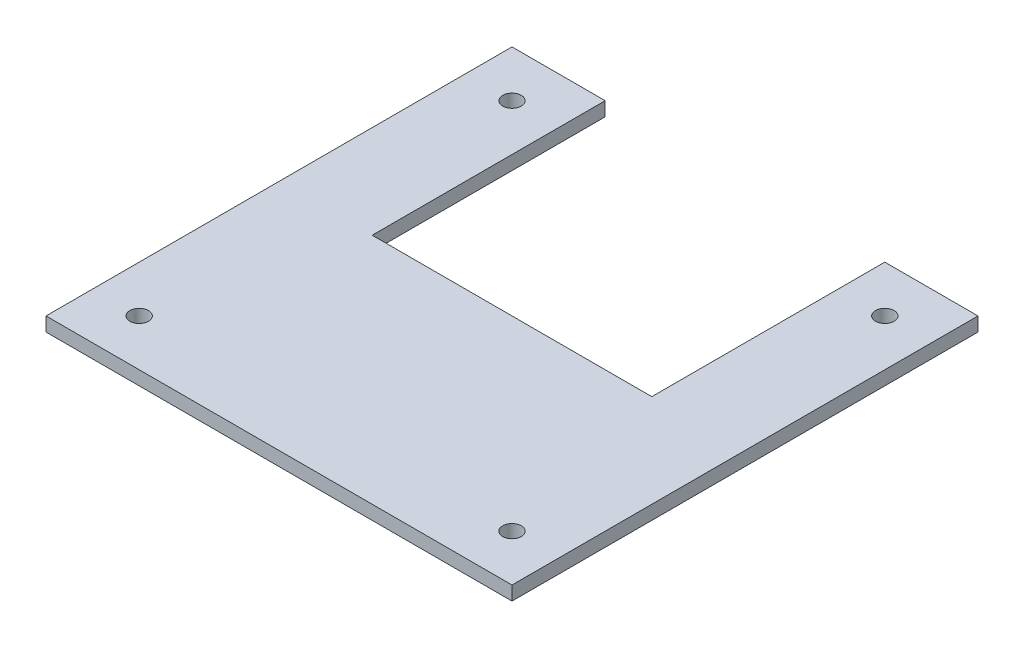
ISO-10303-21;
HEADER;
FILE_DESCRIPTION(('STEP AP214'),'2;1');
FILE_NAME('part.step','',(''),(''),'','','');
FILE_SCHEMA(('AUTOMOTIVE_DESIGN { 1 0 10303 214 1 1 1 1 }'));
ENDSEC;
DATA;
#1=APPLICATION_CONTEXT('core data for automotive mechanical design processes');
#2=APPLICATION_PROTOCOL_DEFINITION('international standard','automotive_design',2000,#1);
#3=PRODUCT_CONTEXT('',#1,'mechanical');
#4=PRODUCT('Part','Part','',(#3));
#5=PRODUCT_RELATED_PRODUCT_CATEGORY('part','',(#4));
#6=PRODUCT_DEFINITION_FORMATION('','',#4);
#7=PRODUCT_DEFINITION_CONTEXT('part definition',#1,'design');
#8=PRODUCT_DEFINITION('design','',#6,#7);
#9=PRODUCT_DEFINITION_SHAPE('','',#8);
#10=(LENGTH_UNIT() NAMED_UNIT(*) SI_UNIT(.MILLI.,.METRE.));
#11=(NAMED_UNIT(*) PLANE_ANGLE_UNIT() SI_UNIT($,.RADIAN.));
#12=(NAMED_UNIT(*) SI_UNIT($,.STERADIAN.) SOLID_ANGLE_UNIT());
#13=UNCERTAINTY_MEASURE_WITH_UNIT(LENGTH_MEASURE(1.E-05),#10,'distance_accuracy_value','');
#14=(GEOMETRIC_REPRESENTATION_CONTEXT(3) GLOBAL_UNCERTAINTY_ASSIGNED_CONTEXT((#13)) GLOBAL_UNIT_ASSIGNED_CONTEXT((#10,
#11,#12)) REPRESENTATION_CONTEXT('',''));
#15=CARTESIAN_POINT('',(0.,0.,0.));
#16=DIRECTION('',(0.,0.,1.));
#17=DIRECTION('',(1.,0.,0.));
#18=AXIS2_PLACEMENT_3D('',#15,#16,#17);
#19=CARTESIAN_POINT('',(0.,3.,0.));
#20=DIRECTION('',(0.,-1.,0.));
#21=DIRECTION('',(0.,0.,-1.));
#22=AXIS2_PLACEMENT_3D('',#19,#20,#21);
#23=PLANE('',#22);
#24=DIRECTION('',(0.,0.,1.));
#25=VECTOR('',#24,1.);
#26=CARTESIAN_POINT('',(-50.,3.,-50.));
#27=LINE('',#26,#25);
#28=CARTESIAN_POINT('',(-50.,3.,-50.));
#29=VERTEX_POINT('',#28);
#30=CARTESIAN_POINT('',(-50.,3.,50.));
#31=VERTEX_POINT('',#30);
#32=EDGE_CURVE('E168',#29,#31,#27,.T.);
#33=ORIENTED_EDGE('',*,*,#32,.T.);
#34=DIRECTION('',(1.,0.,0.));
#35=VECTOR('',#34,1.);
#36=CARTESIAN_POINT('',(50.,3.,50.));
#37=LINE('',#36,#35);
#38=CARTESIAN_POINT('',(50.,3.,50.));
#39=VERTEX_POINT('',#38);
#40=EDGE_CURVE('E104',#31,#39,#37,.T.);
#41=ORIENTED_EDGE('',*,*,#40,.T.);
#42=DIRECTION('',(0.,0.,-1.));
#43=VECTOR('',#42,1.);
#44=CARTESIAN_POINT('',(50.,3.,-50.));
#45=LINE('',#44,#43);
#46=CARTESIAN_POINT('',(50.,3.,-50.));
#47=VERTEX_POINT('',#46);
#48=EDGE_CURVE('E189',#39,#47,#45,.T.);
#49=ORIENTED_EDGE('',*,*,#48,.T.);
#50=DIRECTION('',(-1.,0.,0.));
#51=VECTOR('',#50,1.);
#52=CARTESIAN_POINT('',(50.,3.,-50.));
#53=LINE('',#52,#51);
#54=CARTESIAN_POINT('',(30.,3.,-50.));
#55=VERTEX_POINT('',#54);
#56=EDGE_CURVE('E203',#47,#55,#53,.T.);
#57=ORIENTED_EDGE('',*,*,#56,.T.);
#58=DIRECTION('',(0.,0.,1.));
#59=VECTOR('',#58,1.);
#60=CARTESIAN_POINT('',(30.,3.,0.));
#61=LINE('',#60,#59);
#62=CARTESIAN_POINT('',(30.,3.,0.));
#63=VERTEX_POINT('',#62);
#64=EDGE_CURVE('E123',#55,#63,#61,.T.);
#65=ORIENTED_EDGE('',*,*,#64,.T.);
#66=DIRECTION('',(-1.,0.,0.));
#67=VECTOR('',#66,1.);
#68=CARTESIAN_POINT('',(-30.,3.,0.));
#69=LINE('',#68,#67);
#70=CARTESIAN_POINT('',(-30.,3.,0.));
#71=VERTEX_POINT('',#70);
#72=EDGE_CURVE('E117',#63,#71,#69,.T.);
#73=ORIENTED_EDGE('',*,*,#72,.T.);
#74=DIRECTION('',(0.,0.,-1.));
#75=VECTOR('',#74,1.);
#76=CARTESIAN_POINT('',(-30.,3.,-50.));
#77=LINE('',#76,#75);
#78=CARTESIAN_POINT('',(-30.,3.,-50.));
#79=VERTEX_POINT('',#78);
#80=EDGE_CURVE('E121',#71,#79,#77,.T.);
#81=ORIENTED_EDGE('',*,*,#80,.T.);
#82=DIRECTION('',(-1.,0.,0.));
#83=VECTOR('',#82,1.);
#84=CARTESIAN_POINT('',(-30.,3.,-50.));
#85=LINE('',#84,#83);
#86=EDGE_CURVE('E61',#79,#29,#85,.T.);
#87=ORIENTED_EDGE('',*,*,#86,.T.);
#88=EDGE_LOOP('',(#33,#41,#49,#57,#65,#73,#81,#87));
#89=FACE_BOUND('',#88,.T.);
#90=CARTESIAN_POINT('',(-40.,3.,40.));
#91=DIRECTION('',(0.,1.,0.));
#92=DIRECTION('',(0.,0.,1.));
#93=AXIS2_PLACEMENT_3D('',#90,#91,#92);
#94=CIRCLE('',#93,2.);
#95=CARTESIAN_POINT('',(-40.,3.,42.));
#96=VERTEX_POINT('',#95);
#97=EDGE_CURVE('E150',#96,#96,#94,.T.);
#98=ORIENTED_EDGE('',*,*,#97,.F.);
#99=EDGE_LOOP('',(#98));
#100=FACE_BOUND('',#99,.T.);
#101=CARTESIAN_POINT('',(40.,3.,40.));
#102=DIRECTION('',(0.,1.,0.));
#103=DIRECTION('',(0.,0.,-1.));
#104=AXIS2_PLACEMENT_3D('',#101,#102,#103);
#105=CIRCLE('',#104,2.);
#106=CARTESIAN_POINT('',(40.,3.,38.));
#107=VERTEX_POINT('',#106);
#108=EDGE_CURVE('E217',#107,#107,#105,.T.);
#109=ORIENTED_EDGE('',*,*,#108,.F.);
#110=EDGE_LOOP('',(#109));
#111=FACE_BOUND('',#110,.T.);
#112=CARTESIAN_POINT('',(40.,3.,-40.));
#113=DIRECTION('',(0.,1.,0.));
#114=DIRECTION('',(0.,0.,1.));
#115=AXIS2_PLACEMENT_3D('',#112,#113,#114);
#116=CIRCLE('',#115,2.);
#117=CARTESIAN_POINT('',(40.,3.,-38.));
#118=VERTEX_POINT('',#117);
#119=EDGE_CURVE('E225',#118,#118,#116,.T.);
#120=ORIENTED_EDGE('',*,*,#119,.F.);
#121=EDGE_LOOP('',(#120));
#122=FACE_BOUND('',#121,.T.);
#123=CARTESIAN_POINT('',(-40.,3.,-40.));
#124=DIRECTION('',(0.,1.,0.));
#125=DIRECTION('',(0.,0.,-1.));
#126=AXIS2_PLACEMENT_3D('',#123,#124,#125);
#127=CIRCLE('',#126,2.);
#128=CARTESIAN_POINT('',(-40.,3.,-42.));
#129=VERTEX_POINT('',#128);
#130=EDGE_CURVE('E233',#129,#129,#127,.T.);
#131=ORIENTED_EDGE('',*,*,#130,.F.);
#132=EDGE_LOOP('',(#131));
#133=FACE_BOUND('',#132,.T.);
#134=ADVANCED_FACE('F43',(#89,#100,#111,#122,#133),#23,.F.);
#135=CARTESIAN_POINT('',(0.,0.,0.));
#136=DIRECTION('',(0.,-1.,0.));
#137=DIRECTION('',(0.,0.,-1.));
#138=AXIS2_PLACEMENT_3D('',#135,#136,#137);
#139=PLANE('',#138);
#140=CARTESIAN_POINT('',(40.,0.,-40.));
#141=DIRECTION('',(0.,1.,0.));
#142=DIRECTION('',(0.,0.,1.));
#143=AXIS2_PLACEMENT_3D('',#140,#141,#142);
#144=CIRCLE('',#143,2.);
#145=CARTESIAN_POINT('',(40.,0.,-38.));
#146=VERTEX_POINT('',#145);
#147=EDGE_CURVE('E229',#146,#146,#144,.T.);
#148=ORIENTED_EDGE('',*,*,#147,.T.);
#149=EDGE_LOOP('',(#148));
#150=FACE_BOUND('',#149,.T.);
#151=CARTESIAN_POINT('',(-40.,0.,40.));
#152=DIRECTION('',(0.,1.,0.));
#153=DIRECTION('',(0.,0.,1.));
#154=AXIS2_PLACEMENT_3D('',#151,#152,#153);
#155=CIRCLE('',#154,2.);
#156=CARTESIAN_POINT('',(-40.,0.,42.));
#157=VERTEX_POINT('',#156);
#158=EDGE_CURVE('E213',#157,#157,#155,.T.);
#159=ORIENTED_EDGE('',*,*,#158,.T.);
#160=EDGE_LOOP('',(#159));
#161=FACE_BOUND('',#160,.T.);
#162=DIRECTION('',(0.,0.,1.));
#163=VECTOR('',#162,1.);
#164=CARTESIAN_POINT('',(-50.,0.,-50.));
#165=LINE('',#164,#163);
#166=CARTESIAN_POINT('',(-50.,0.,-50.));
#167=VERTEX_POINT('',#166);
#168=CARTESIAN_POINT('',(-50.,0.,50.));
#169=VERTEX_POINT('',#168);
#170=EDGE_CURVE('E145',#167,#169,#165,.T.);
#171=ORIENTED_EDGE('',*,*,#170,.F.);
#172=DIRECTION('',(-1.,0.,0.));
#173=VECTOR('',#172,1.);
#174=CARTESIAN_POINT('',(-30.,0.,-50.));
#175=LINE('',#174,#173);
#176=CARTESIAN_POINT('',(-30.,0.,-50.));
#177=VERTEX_POINT('',#176);
#178=EDGE_CURVE('E96',#177,#167,#175,.T.);
#179=ORIENTED_EDGE('',*,*,#178,.F.);
#180=DIRECTION('',(0.,0.,-1.));
#181=VECTOR('',#180,1.);
#182=CARTESIAN_POINT('',(-30.,0.,-50.));
#183=LINE('',#182,#181);
#184=CARTESIAN_POINT('',(-30.,0.,0.));
#185=VERTEX_POINT('',#184);
#186=EDGE_CURVE('E90',#185,#177,#183,.T.);
#187=ORIENTED_EDGE('',*,*,#186,.F.);
#188=DIRECTION('',(-1.,0.,0.));
#189=VECTOR('',#188,1.);
#190=CARTESIAN_POINT('',(-30.,0.,0.));
#191=LINE('',#190,#189);
#192=CARTESIAN_POINT('',(30.,0.,0.));
#193=VERTEX_POINT('',#192);
#194=EDGE_CURVE('E132',#193,#185,#191,.T.);
#195=ORIENTED_EDGE('',*,*,#194,.F.);
#196=DIRECTION('',(0.,0.,1.));
#197=VECTOR('',#196,1.);
#198=CARTESIAN_POINT('',(30.,0.,0.));
#199=LINE('',#198,#197);
#200=CARTESIAN_POINT('',(30.,0.,-50.));
#201=VERTEX_POINT('',#200);
#202=EDGE_CURVE('E159',#201,#193,#199,.T.);
#203=ORIENTED_EDGE('',*,*,#202,.F.);
#204=DIRECTION('',(-1.,0.,0.));
#205=VECTOR('',#204,1.);
#206=CARTESIAN_POINT('',(50.,0.,-50.));
#207=LINE('',#206,#205);
#208=CARTESIAN_POINT('',(50.,0.,-50.));
#209=VERTEX_POINT('',#208);
#210=EDGE_CURVE('E156',#209,#201,#207,.T.);
#211=ORIENTED_EDGE('',*,*,#210,.F.);
#212=DIRECTION('',(0.,0.,-1.));
#213=VECTOR('',#212,1.);
#214=CARTESIAN_POINT('',(50.,0.,-50.));
#215=LINE('',#214,#213);
#216=CARTESIAN_POINT('',(50.,0.,50.));
#217=VERTEX_POINT('',#216);
#218=EDGE_CURVE('E153',#217,#209,#215,.T.);
#219=ORIENTED_EDGE('',*,*,#218,.F.);
#220=DIRECTION('',(1.,0.,0.));
#221=VECTOR('',#220,1.);
#222=CARTESIAN_POINT('',(50.,0.,50.));
#223=LINE('',#222,#221);
#224=EDGE_CURVE('E149',#169,#217,#223,.T.);
#225=ORIENTED_EDGE('',*,*,#224,.F.);
#226=EDGE_LOOP('',(#171,#179,#187,#195,#203,#211,#219,#225));
#227=FACE_BOUND('',#226,.T.);
#228=CARTESIAN_POINT('',(40.,0.,40.));
#229=DIRECTION('',(0.,1.,0.));
#230=DIRECTION('',(0.,0.,-1.));
#231=AXIS2_PLACEMENT_3D('',#228,#229,#230);
#232=CIRCLE('',#231,2.);
#233=CARTESIAN_POINT('',(40.,0.,38.));
#234=VERTEX_POINT('',#233);
#235=EDGE_CURVE('E221',#234,#234,#232,.T.);
#236=ORIENTED_EDGE('',*,*,#235,.T.);
#237=EDGE_LOOP('',(#236));
#238=FACE_BOUND('',#237,.T.);
#239=CARTESIAN_POINT('',(-40.,0.,-40.));
#240=DIRECTION('',(0.,1.,0.));
#241=DIRECTION('',(0.,0.,-1.));
#242=AXIS2_PLACEMENT_3D('',#239,#240,#241);
#243=CIRCLE('',#242,2.);
#244=CARTESIAN_POINT('',(-40.,0.,-42.));
#245=VERTEX_POINT('',#244);
#246=EDGE_CURVE('E237',#245,#245,#243,.T.);
#247=ORIENTED_EDGE('',*,*,#246,.T.);
#248=EDGE_LOOP('',(#247));
#249=FACE_BOUND('',#248,.T.);
#250=ADVANCED_FACE('F193',(#150,#161,#227,#238,#249),#139,.T.);
#251=CARTESIAN_POINT('',(-50.,3.,-50.));
#252=DIRECTION('',(1.,0.,0.));
#253=DIRECTION('',(0.,0.,-1.));
#254=AXIS2_PLACEMENT_3D('',#251,#252,#253);
#255=PLANE('',#254);
#256=ORIENTED_EDGE('',*,*,#170,.T.);
#257=DIRECTION('',(0.,-1.,0.));
#258=VECTOR('',#257,1.);
#259=CARTESIAN_POINT('',(-50.,3.,50.));
#260=LINE('',#259,#258);
#261=EDGE_CURVE('E11',#31,#169,#260,.T.);
#262=ORIENTED_EDGE('',*,*,#261,.F.);
#263=ORIENTED_EDGE('',*,*,#32,.F.);
#264=DIRECTION('',(0.,-1.,0.));
#265=VECTOR('',#264,1.);
#266=CARTESIAN_POINT('',(-50.,3.,-50.));
#267=LINE('',#266,#265);
#268=EDGE_CURVE('E141',#29,#167,#267,.T.);
#269=ORIENTED_EDGE('',*,*,#268,.T.);
#270=EDGE_LOOP('',(#256,#262,#263,#269));
#271=FACE_BOUND('',#270,.T.);
#272=ADVANCED_FACE('F45',(#271),#255,.F.);
#273=CARTESIAN_POINT('',(50.,3.,50.));
#274=DIRECTION('',(0.,0.,-1.));
#275=DIRECTION('',(-1.,0.,0.));
#276=AXIS2_PLACEMENT_3D('',#273,#274,#275);
#277=PLANE('',#276);
#278=ORIENTED_EDGE('',*,*,#224,.T.);
#279=DIRECTION('',(0.,-1.,0.));
#280=VECTOR('',#279,1.);
#281=CARTESIAN_POINT('',(50.,3.,50.));
#282=LINE('',#281,#280);
#283=EDGE_CURVE('E53',#39,#217,#282,.T.);
#284=ORIENTED_EDGE('',*,*,#283,.F.);
#285=ORIENTED_EDGE('',*,*,#40,.F.);
#286=ORIENTED_EDGE('',*,*,#261,.T.);
#287=EDGE_LOOP('',(#278,#284,#285,#286));
#288=FACE_BOUND('',#287,.T.);
#289=ADVANCED_FACE('F271',(#288),#277,.F.);
#290=CARTESIAN_POINT('',(50.,3.,-50.));
#291=DIRECTION('',(-1.,0.,0.));
#292=DIRECTION('',(0.,0.,1.));
#293=AXIS2_PLACEMENT_3D('',#290,#291,#292);
#294=PLANE('',#293);
#295=ORIENTED_EDGE('',*,*,#218,.T.);
#296=DIRECTION('',(0.,-1.,0.));
#297=VECTOR('',#296,1.);
#298=CARTESIAN_POINT('',(50.,3.,-50.));
#299=LINE('',#298,#297);
#300=EDGE_CURVE('E179',#47,#209,#299,.T.);
#301=ORIENTED_EDGE('',*,*,#300,.F.);
#302=ORIENTED_EDGE('',*,*,#48,.F.);
#303=ORIENTED_EDGE('',*,*,#283,.T.);
#304=EDGE_LOOP('',(#295,#301,#302,#303));
#305=FACE_BOUND('',#304,.T.);
#306=ADVANCED_FACE('F187',(#305),#294,.F.);
#307=CARTESIAN_POINT('',(50.,3.,-50.));
#308=DIRECTION('',(0.,0.,1.));
#309=DIRECTION('',(1.,0.,0.));
#310=AXIS2_PLACEMENT_3D('',#307,#308,#309);
#311=PLANE('',#310);
#312=ORIENTED_EDGE('',*,*,#210,.T.);
#313=DIRECTION('',(0.,-1.,0.));
#314=VECTOR('',#313,1.);
#315=CARTESIAN_POINT('',(30.,3.,-50.));
#316=LINE('',#315,#314);
#317=EDGE_CURVE('E175',#55,#201,#316,.T.);
#318=ORIENTED_EDGE('',*,*,#317,.F.);
#319=ORIENTED_EDGE('',*,*,#56,.F.);
#320=ORIENTED_EDGE('',*,*,#300,.T.);
#321=EDGE_LOOP('',(#312,#318,#319,#320));
#322=FACE_BOUND('',#321,.T.);
#323=ADVANCED_FACE('F198',(#322),#311,.F.);
#324=CARTESIAN_POINT('',(30.,3.,0.));
#325=DIRECTION('',(1.,0.,0.));
#326=DIRECTION('',(0.,0.,-1.));
#327=AXIS2_PLACEMENT_3D('',#324,#325,#326);
#328=PLANE('',#327);
#329=ORIENTED_EDGE('',*,*,#202,.T.);
#330=DIRECTION('',(0.,-1.,0.));
#331=VECTOR('',#330,1.);
#332=CARTESIAN_POINT('',(30.,3.,0.));
#333=LINE('',#332,#331);
#334=EDGE_CURVE('E134',#63,#193,#333,.T.);
#335=ORIENTED_EDGE('',*,*,#334,.F.);
#336=ORIENTED_EDGE('',*,*,#64,.F.);
#337=ORIENTED_EDGE('',*,*,#317,.T.);
#338=EDGE_LOOP('',(#329,#335,#336,#337));
#339=FACE_BOUND('',#338,.T.);
#340=ADVANCED_FACE('F201',(#339),#328,.F.);
#341=CARTESIAN_POINT('',(-30.,3.,0.));
#342=DIRECTION('',(0.,0.,1.));
#343=DIRECTION('',(1.,0.,0.));
#344=AXIS2_PLACEMENT_3D('',#341,#342,#343);
#345=PLANE('',#344);
#346=ORIENTED_EDGE('',*,*,#194,.T.);
#347=DIRECTION('',(0.,-1.,0.));
#348=VECTOR('',#347,1.);
#349=CARTESIAN_POINT('',(-30.,3.,0.));
#350=LINE('',#349,#348);
#351=EDGE_CURVE('E129',#71,#185,#350,.T.);
#352=ORIENTED_EDGE('',*,*,#351,.F.);
#353=ORIENTED_EDGE('',*,*,#72,.F.);
#354=ORIENTED_EDGE('',*,*,#334,.T.);
#355=EDGE_LOOP('',(#346,#352,#353,#354));
#356=FACE_BOUND('',#355,.T.);
#357=ADVANCED_FACE('F130',(#356),#345,.F.);
#358=CARTESIAN_POINT('',(-30.,3.,-50.));
#359=DIRECTION('',(-1.,0.,0.));
#360=DIRECTION('',(0.,0.,1.));
#361=AXIS2_PLACEMENT_3D('',#358,#359,#360);
#362=PLANE('',#361);
#363=ORIENTED_EDGE('',*,*,#186,.T.);
#364=DIRECTION('',(0.,-1.,0.));
#365=VECTOR('',#364,1.);
#366=CARTESIAN_POINT('',(-30.,3.,-50.));
#367=LINE('',#366,#365);
#368=EDGE_CURVE('E135',#79,#177,#367,.T.);
#369=ORIENTED_EDGE('',*,*,#368,.F.);
#370=ORIENTED_EDGE('',*,*,#80,.F.);
#371=ORIENTED_EDGE('',*,*,#351,.T.);
#372=EDGE_LOOP('',(#363,#369,#370,#371));
#373=FACE_BOUND('',#372,.T.);
#374=ADVANCED_FACE('F137',(#373),#362,.F.);
#375=CARTESIAN_POINT('',(-30.,3.,-50.));
#376=DIRECTION('',(0.,0.,1.));
#377=DIRECTION('',(1.,0.,0.));
#378=AXIS2_PLACEMENT_3D('',#375,#376,#377);
#379=PLANE('',#378);
#380=ORIENTED_EDGE('',*,*,#178,.T.);
#381=ORIENTED_EDGE('',*,*,#268,.F.);
#382=ORIENTED_EDGE('',*,*,#86,.F.);
#383=ORIENTED_EDGE('',*,*,#368,.T.);
#384=EDGE_LOOP('',(#380,#381,#382,#383));
#385=FACE_BOUND('',#384,.T.);
#386=ADVANCED_FACE('F259',(#385),#379,.F.);
#387=CARTESIAN_POINT('',(-40.,3.,40.));
#388=DIRECTION('',(0.,-1.,0.));
#389=DIRECTION('',(0.,0.,-1.));
#390=AXIS2_PLACEMENT_3D('',#387,#388,#389);
#391=CYLINDRICAL_SURFACE('',#390,2.);
#392=ORIENTED_EDGE('',*,*,#97,.T.);
#393=EDGE_LOOP('',(#392));
#394=FACE_BOUND('',#393,.T.);
#395=ORIENTED_EDGE('',*,*,#158,.F.);
#396=EDGE_LOOP('',(#395));
#397=FACE_BOUND('',#396,.T.);
#398=ADVANCED_FACE('F256',(#394,#397),#391,.F.);
#399=CARTESIAN_POINT('',(40.,3.,40.));
#400=DIRECTION('',(0.,-1.,0.));
#401=DIRECTION('',(0.,0.,-1.));
#402=AXIS2_PLACEMENT_3D('',#399,#400,#401);
#403=CYLINDRICAL_SURFACE('',#402,2.);
#404=ORIENTED_EDGE('',*,*,#108,.T.);
#405=EDGE_LOOP('',(#404));
#406=FACE_BOUND('',#405,.T.);
#407=ORIENTED_EDGE('',*,*,#235,.F.);
#408=EDGE_LOOP('',(#407));
#409=FACE_BOUND('',#408,.T.);
#410=ADVANCED_FACE('F347',(#406,#409),#403,.F.);
#411=CARTESIAN_POINT('',(40.,3.,-40.));
#412=DIRECTION('',(0.,-1.,0.));
#413=DIRECTION('',(0.,0.,-1.));
#414=AXIS2_PLACEMENT_3D('',#411,#412,#413);
#415=CYLINDRICAL_SURFACE('',#414,2.);
#416=ORIENTED_EDGE('',*,*,#119,.T.);
#417=EDGE_LOOP('',(#416));
#418=FACE_BOUND('',#417,.T.);
#419=ORIENTED_EDGE('',*,*,#147,.F.);
#420=EDGE_LOOP('',(#419));
#421=FACE_BOUND('',#420,.T.);
#422=ADVANCED_FACE('F356',(#418,#421),#415,.F.);
#423=CARTESIAN_POINT('',(-40.,3.,-40.));
#424=DIRECTION('',(0.,-1.,0.));
#425=DIRECTION('',(0.,0.,-1.));
#426=AXIS2_PLACEMENT_3D('',#423,#424,#425);
#427=CYLINDRICAL_SURFACE('',#426,2.);
#428=ORIENTED_EDGE('',*,*,#130,.T.);
#429=EDGE_LOOP('',(#428));
#430=FACE_BOUND('',#429,.T.);
#431=ORIENTED_EDGE('',*,*,#246,.F.);
#432=EDGE_LOOP('',(#431));
#433=FACE_BOUND('',#432,.T.);
#434=ADVANCED_FACE('F245',(#430,#433),#427,.F.);
#435=CLOSED_SHELL('',(#134,#250,#272,#289,#306,#323,#340,#357,#374,#386,#398,#410,#422,#434));
#436=MANIFOLD_SOLID_BREP('B2',#435);
#437=ADVANCED_BREP_SHAPE_REPRESENTATION('',(#18,#436),#14);
#438=SHAPE_DEFINITION_REPRESENTATION(#9,#437);
ENDSEC;
END-ISO-10303-21;
